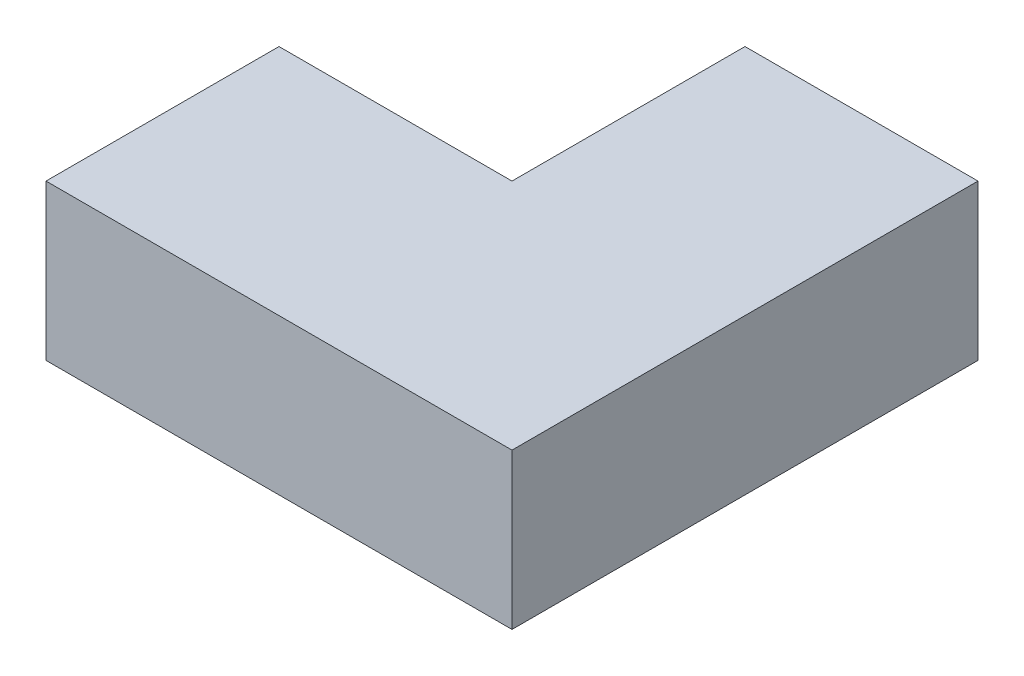
ISO-10303-21;
HEADER;
FILE_DESCRIPTION(('STEP AP214'),'2;1');
FILE_NAME('part.step','',(''),(''),'','','');
FILE_SCHEMA(('AUTOMOTIVE_DESIGN { 1 0 10303 214 1 1 1 1 }'));
ENDSEC;
DATA;
#1=APPLICATION_CONTEXT('core data for automotive mechanical design processes');
#2=APPLICATION_PROTOCOL_DEFINITION('international standard','automotive_design',2000,#1);
#3=PRODUCT_CONTEXT('',#1,'mechanical');
#4=PRODUCT('Part','Part','',(#3));
#5=PRODUCT_RELATED_PRODUCT_CATEGORY('part','',(#4));
#6=PRODUCT_DEFINITION_FORMATION('','',#4);
#7=PRODUCT_DEFINITION_CONTEXT('part definition',#1,'design');
#8=PRODUCT_DEFINITION('design','',#6,#7);
#9=PRODUCT_DEFINITION_SHAPE('','',#8);
#10=(LENGTH_UNIT() NAMED_UNIT(*) SI_UNIT(.MILLI.,.METRE.));
#11=(NAMED_UNIT(*) PLANE_ANGLE_UNIT() SI_UNIT($,.RADIAN.));
#12=(NAMED_UNIT(*) SI_UNIT($,.STERADIAN.) SOLID_ANGLE_UNIT());
#13=UNCERTAINTY_MEASURE_WITH_UNIT(LENGTH_MEASURE(1.E-05),#10,'distance_accuracy_value','');
#14=(GEOMETRIC_REPRESENTATION_CONTEXT(3) GLOBAL_UNCERTAINTY_ASSIGNED_CONTEXT((#13)) GLOBAL_UNIT_ASSIGNED_CONTEXT((#10,
#11,#12)) REPRESENTATION_CONTEXT('',''));
#15=CARTESIAN_POINT('',(0.,0.,0.));
#16=DIRECTION('',(0.,0.,1.));
#17=DIRECTION('',(1.,0.,0.));
#18=AXIS2_PLACEMENT_3D('',#15,#16,#17);
#19=CARTESIAN_POINT('',(7.,0.5,0.));
#20=DIRECTION('',(0.,0.,-1.));
#21=DIRECTION('',(-1.,0.,0.));
#22=AXIS2_PLACEMENT_3D('',#19,#20,#21);
#23=PLANE('',#22);
#24=DIRECTION('',(1.,0.,0.));
#25=VECTOR('',#24,1.);
#26=CARTESIAN_POINT('',(7.,0.,0.));
#27=LINE('',#26,#25);
#28=CARTESIAN_POINT('',(0.,0.,0.));
#29=VERTEX_POINT('',#28);
#30=CARTESIAN_POINT('',(7.,0.,0.));
#31=VERTEX_POINT('',#30);
#32=EDGE_CURVE('E87',#29,#31,#27,.T.);
#33=ORIENTED_EDGE('',*,*,#32,.T.);
#34=DIRECTION('',(0.,-1.,0.));
#35=VECTOR('',#34,1.);
#36=CARTESIAN_POINT('',(7.,0.5,0.));
#37=LINE('',#36,#35);
#38=CARTESIAN_POINT('',(7.,0.5,0.));
#39=VERTEX_POINT('',#38);
#40=EDGE_CURVE('E11',#39,#31,#37,.T.);
#41=ORIENTED_EDGE('',*,*,#40,.F.);
#42=DIRECTION('',(1.,0.,0.));
#43=VECTOR('',#42,1.);
#44=CARTESIAN_POINT('',(7.,0.5,0.));
#45=LINE('',#44,#43);
#46=CARTESIAN_POINT('',(0.,0.5,0.));
#47=VERTEX_POINT('',#46);
#48=EDGE_CURVE('E82',#47,#39,#45,.T.);
#49=ORIENTED_EDGE('',*,*,#48,.F.);
#50=DIRECTION('',(0.,-1.,0.));
#51=VECTOR('',#50,1.);
#52=CARTESIAN_POINT('',(0.,0.5,0.));
#53=LINE('',#52,#51);
#54=EDGE_CURVE('E49',#47,#29,#53,.T.);
#55=ORIENTED_EDGE('',*,*,#54,.T.);
#56=EDGE_LOOP('',(#33,#41,#49,#55));
#57=FACE_BOUND('',#56,.T.);
#58=ADVANCED_FACE('F33',(#57),#23,.F.);
#59=CARTESIAN_POINT('',(7.,0.5,-7.));
#60=DIRECTION('',(-1.,0.,0.));
#61=DIRECTION('',(0.,0.,1.));
#62=AXIS2_PLACEMENT_3D('',#59,#60,#61);
#63=PLANE('',#62);
#64=DIRECTION('',(0.,0.,-1.));
#65=VECTOR('',#64,1.);
#66=CARTESIAN_POINT('',(7.,0.,-7.));
#67=LINE('',#66,#65);
#68=CARTESIAN_POINT('',(7.,0.,-7.));
#69=VERTEX_POINT('',#68);
#70=EDGE_CURVE('E94',#31,#69,#67,.T.);
#71=ORIENTED_EDGE('',*,*,#70,.T.);
#72=DIRECTION('',(0.,-1.,0.));
#73=VECTOR('',#72,1.);
#74=CARTESIAN_POINT('',(7.,0.5,-7.));
#75=LINE('',#74,#73);
#76=CARTESIAN_POINT('',(7.,0.5,-7.));
#77=VERTEX_POINT('',#76);
#78=EDGE_CURVE('E41',#77,#69,#75,.T.);
#79=ORIENTED_EDGE('',*,*,#78,.F.);
#80=DIRECTION('',(0.,0.,-1.));
#81=VECTOR('',#80,1.);
#82=CARTESIAN_POINT('',(7.,0.5,-7.));
#83=LINE('',#82,#81);
#84=EDGE_CURVE('E90',#39,#77,#83,.T.);
#85=ORIENTED_EDGE('',*,*,#84,.F.);
#86=ORIENTED_EDGE('',*,*,#40,.T.);
#87=EDGE_LOOP('',(#71,#79,#85,#86));
#88=FACE_BOUND('',#87,.T.);
#89=ADVANCED_FACE('F172',(#88),#63,.F.);
#90=CARTESIAN_POINT('',(4.5,0.5,-7.));
#91=DIRECTION('',(0.,0.,1.));
#92=DIRECTION('',(1.,0.,0.));
#93=AXIS2_PLACEMENT_3D('',#90,#91,#92);
#94=PLANE('',#93);
#95=DIRECTION('',(-1.,0.,0.));
#96=VECTOR('',#95,1.);
#97=CARTESIAN_POINT('',(4.5,0.,-7.));
#98=LINE('',#97,#96);
#99=CARTESIAN_POINT('',(4.5,0.,-7.));
#100=VERTEX_POINT('',#99);
#101=EDGE_CURVE('E97',#69,#100,#98,.T.);
#102=ORIENTED_EDGE('',*,*,#101,.T.);
#103=DIRECTION('',(0.,-1.,0.));
#104=VECTOR('',#103,1.);
#105=CARTESIAN_POINT('',(4.5,0.5,-7.));
#106=LINE('',#105,#104);
#107=CARTESIAN_POINT('',(4.5,3.5,-7.));
#108=VERTEX_POINT('',#107);
#109=EDGE_CURVE('E112',#108,#100,#106,.T.);
#110=ORIENTED_EDGE('',*,*,#109,.F.);
#111=DIRECTION('',(-1.,0.,0.));
#112=VECTOR('',#111,1.);
#113=CARTESIAN_POINT('',(9.,3.5,-7.));
#114=LINE('',#113,#112);
#115=CARTESIAN_POINT('',(9.,3.5,-7.));
#116=VERTEX_POINT('',#115);
#117=EDGE_CURVE('E153',#116,#108,#114,.T.);
#118=ORIENTED_EDGE('',*,*,#117,.F.);
#119=DIRECTION('',(0.,-1.,0.));
#120=VECTOR('',#119,1.);
#121=CARTESIAN_POINT('',(9.,3.5,-7.));
#122=LINE('',#121,#120);
#123=CARTESIAN_POINT('',(9.,0.5,-7.));
#124=VERTEX_POINT('',#123);
#125=EDGE_CURVE('E158',#116,#124,#122,.T.);
#126=ORIENTED_EDGE('',*,*,#125,.T.);
#127=DIRECTION('',(-1.,0.,0.));
#128=VECTOR('',#127,1.);
#129=CARTESIAN_POINT('',(7.,0.5,-7.));
#130=LINE('',#129,#128);
#131=EDGE_CURVE('E122',#124,#77,#130,.T.);
#132=ORIENTED_EDGE('',*,*,#131,.T.);
#133=ORIENTED_EDGE('',*,*,#78,.T.);
#134=EDGE_LOOP('',(#102,#110,#118,#126,#132,#133));
#135=FACE_BOUND('',#134,.T.);
#136=ADVANCED_FACE('F118',(#135),#94,.F.);
#137=CARTESIAN_POINT('',(4.5,0.5,-2.5));
#138=DIRECTION('',(1.,0.,0.));
#139=DIRECTION('',(0.,0.,-1.));
#140=AXIS2_PLACEMENT_3D('',#137,#138,#139);
#141=PLANE('',#140);
#142=DIRECTION('',(0.,0.,1.));
#143=VECTOR('',#142,1.);
#144=CARTESIAN_POINT('',(4.5,0.,-2.5));
#145=LINE('',#144,#143);
#146=CARTESIAN_POINT('',(4.5,0.,-2.5));
#147=VERTEX_POINT('',#146);
#148=EDGE_CURVE('E106',#100,#147,#145,.T.);
#149=ORIENTED_EDGE('',*,*,#148,.T.);
#150=DIRECTION('',(0.,-1.,0.));
#151=VECTOR('',#150,1.);
#152=CARTESIAN_POINT('',(4.5,0.5,-2.5));
#153=LINE('',#152,#151);
#154=CARTESIAN_POINT('',(4.5,3.5,-2.5));
#155=VERTEX_POINT('',#154);
#156=EDGE_CURVE('E110',#155,#147,#153,.T.);
#157=ORIENTED_EDGE('',*,*,#156,.F.);
#158=DIRECTION('',(0.,0.,1.));
#159=VECTOR('',#158,1.);
#160=CARTESIAN_POINT('',(4.5,3.5,-7.));
#161=LINE('',#160,#159);
#162=EDGE_CURVE('E156',#108,#155,#161,.T.);
#163=ORIENTED_EDGE('',*,*,#162,.F.);
#164=ORIENTED_EDGE('',*,*,#109,.T.);
#165=EDGE_LOOP('',(#149,#157,#163,#164));
#166=FACE_BOUND('',#165,.T.);
#167=ADVANCED_FACE('F128',(#166),#141,.F.);
#168=CARTESIAN_POINT('',(0.,0.5,-2.5));
#169=DIRECTION('',(0.,0.,1.));
#170=DIRECTION('',(1.,0.,0.));
#171=AXIS2_PLACEMENT_3D('',#168,#169,#170);
#172=PLANE('',#171);
#173=DIRECTION('',(-1.,0.,0.));
#174=VECTOR('',#173,1.);
#175=CARTESIAN_POINT('',(0.,0.,-2.5));
#176=LINE('',#175,#174);
#177=CARTESIAN_POINT('',(0.,0.,-2.5));
#178=VERTEX_POINT('',#177);
#179=EDGE_CURVE('E73',#147,#178,#176,.T.);
#180=ORIENTED_EDGE('',*,*,#179,.T.);
#181=DIRECTION('',(0.,-1.,0.));
#182=VECTOR('',#181,1.);
#183=CARTESIAN_POINT('',(0.,0.5,-2.5));
#184=LINE('',#183,#182);
#185=CARTESIAN_POINT('',(0.,3.5,-2.5));
#186=VERTEX_POINT('',#185);
#187=EDGE_CURVE('E79',#186,#178,#184,.T.);
#188=ORIENTED_EDGE('',*,*,#187,.F.);
#189=DIRECTION('',(-1.,0.,0.));
#190=VECTOR('',#189,1.);
#191=CARTESIAN_POINT('',(4.5,3.5,-2.5));
#192=LINE('',#191,#190);
#193=EDGE_CURVE('E135',#155,#186,#192,.T.);
#194=ORIENTED_EDGE('',*,*,#193,.F.);
#195=ORIENTED_EDGE('',*,*,#156,.T.);
#196=EDGE_LOOP('',(#180,#188,#194,#195));
#197=FACE_BOUND('',#196,.T.);
#198=ADVANCED_FACE('F133',(#197),#172,.F.);
#199=CARTESIAN_POINT('',(0.,0.5,0.));
#200=DIRECTION('',(1.,0.,0.));
#201=DIRECTION('',(0.,0.,-1.));
#202=AXIS2_PLACEMENT_3D('',#199,#200,#201);
#203=PLANE('',#202);
#204=DIRECTION('',(0.,0.,1.));
#205=VECTOR('',#204,1.);
#206=CARTESIAN_POINT('',(0.,0.,0.));
#207=LINE('',#206,#205);
#208=EDGE_CURVE('E76',#178,#29,#207,.T.);
#209=ORIENTED_EDGE('',*,*,#208,.T.);
#210=ORIENTED_EDGE('',*,*,#54,.F.);
#211=DIRECTION('',(0.,0.,1.));
#212=VECTOR('',#211,1.);
#213=CARTESIAN_POINT('',(0.,0.5,0.));
#214=LINE('',#213,#212);
#215=CARTESIAN_POINT('',(0.,0.5,2.));
#216=VERTEX_POINT('',#215);
#217=EDGE_CURVE('E159',#47,#216,#214,.T.);
#218=ORIENTED_EDGE('',*,*,#217,.T.);
#219=DIRECTION('',(0.,-1.,0.));
#220=VECTOR('',#219,1.);
#221=CARTESIAN_POINT('',(0.,3.5,2.));
#222=LINE('',#221,#220);
#223=CARTESIAN_POINT('',(0.,3.5,2.));
#224=VERTEX_POINT('',#223);
#225=EDGE_CURVE('E95',#224,#216,#222,.T.);
#226=ORIENTED_EDGE('',*,*,#225,.F.);
#227=DIRECTION('',(0.,0.,1.));
#228=VECTOR('',#227,1.);
#229=CARTESIAN_POINT('',(0.,3.5,-2.5));
#230=LINE('',#229,#228);
#231=EDGE_CURVE('E141',#186,#224,#230,.T.);
#232=ORIENTED_EDGE('',*,*,#231,.F.);
#233=ORIENTED_EDGE('',*,*,#187,.T.);
#234=EDGE_LOOP('',(#209,#210,#218,#226,#232,#233));
#235=FACE_BOUND('',#234,.T.);
#236=ADVANCED_FACE('F77',(#235),#203,.F.);
#237=CARTESIAN_POINT('',(0.,0.,0.));
#238=DIRECTION('',(0.,-1.,0.));
#239=DIRECTION('',(0.,0.,-1.));
#240=AXIS2_PLACEMENT_3D('',#237,#238,#239);
#241=PLANE('',#240);
#242=ORIENTED_EDGE('',*,*,#32,.F.);
#243=ORIENTED_EDGE('',*,*,#208,.F.);
#244=ORIENTED_EDGE('',*,*,#179,.F.);
#245=ORIENTED_EDGE('',*,*,#148,.F.);
#246=ORIENTED_EDGE('',*,*,#101,.F.);
#247=ORIENTED_EDGE('',*,*,#70,.F.);
#248=EDGE_LOOP('',(#242,#243,#244,#245,#246,#247));
#249=FACE_BOUND('',#248,.T.);
#250=ADVANCED_FACE('F92',(#249),#241,.T.);
#251=CARTESIAN_POINT('',(0.,0.5,0.));
#252=DIRECTION('',(0.,1.,0.));
#253=DIRECTION('',(0.,0.,1.));
#254=AXIS2_PLACEMENT_3D('',#251,#252,#253);
#255=PLANE('',#254);
#256=ORIENTED_EDGE('',*,*,#217,.F.);
#257=ORIENTED_EDGE('',*,*,#48,.T.);
#258=ORIENTED_EDGE('',*,*,#84,.T.);
#259=ORIENTED_EDGE('',*,*,#131,.F.);
#260=DIRECTION('',(0.,0.,-1.));
#261=VECTOR('',#260,1.);
#262=CARTESIAN_POINT('',(9.,0.5,2.));
#263=LINE('',#262,#261);
#264=CARTESIAN_POINT('',(9.,0.5,2.));
#265=VERTEX_POINT('',#264);
#266=EDGE_CURVE('E145',#265,#124,#263,.T.);
#267=ORIENTED_EDGE('',*,*,#266,.F.);
#268=DIRECTION('',(1.,0.,0.));
#269=VECTOR('',#268,1.);
#270=CARTESIAN_POINT('',(0.,0.5,2.));
#271=LINE('',#270,#269);
#272=EDGE_CURVE('E161',#216,#265,#271,.T.);
#273=ORIENTED_EDGE('',*,*,#272,.F.);
#274=EDGE_LOOP('',(#256,#257,#258,#259,#267,#273));
#275=FACE_BOUND('',#274,.T.);
#276=ADVANCED_FACE('F169',(#275),#255,.F.);
#277=CARTESIAN_POINT('',(0.,3.5,2.));
#278=DIRECTION('',(0.,0.,-1.));
#279=DIRECTION('',(-1.,0.,0.));
#280=AXIS2_PLACEMENT_3D('',#277,#278,#279);
#281=PLANE('',#280);
#282=ORIENTED_EDGE('',*,*,#272,.T.);
#283=DIRECTION('',(0.,-1.,0.));
#284=VECTOR('',#283,1.);
#285=CARTESIAN_POINT('',(9.,3.5,2.));
#286=LINE('',#285,#284);
#287=CARTESIAN_POINT('',(9.,3.5,2.));
#288=VERTEX_POINT('',#287);
#289=EDGE_CURVE('E100',#288,#265,#286,.T.);
#290=ORIENTED_EDGE('',*,*,#289,.F.);
#291=DIRECTION('',(1.,0.,0.));
#292=VECTOR('',#291,1.);
#293=CARTESIAN_POINT('',(0.,3.5,2.));
#294=LINE('',#293,#292);
#295=EDGE_CURVE('E143',#224,#288,#294,.T.);
#296=ORIENTED_EDGE('',*,*,#295,.F.);
#297=ORIENTED_EDGE('',*,*,#225,.T.);
#298=EDGE_LOOP('',(#282,#290,#296,#297));
#299=FACE_BOUND('',#298,.T.);
#300=ADVANCED_FACE('F188',(#299),#281,.F.);
#301=CARTESIAN_POINT('',(9.,3.5,2.));
#302=DIRECTION('',(-1.,0.,0.));
#303=DIRECTION('',(0.,0.,1.));
#304=AXIS2_PLACEMENT_3D('',#301,#302,#303);
#305=PLANE('',#304);
#306=ORIENTED_EDGE('',*,*,#266,.T.);
#307=ORIENTED_EDGE('',*,*,#125,.F.);
#308=DIRECTION('',(0.,0.,-1.));
#309=VECTOR('',#308,1.);
#310=CARTESIAN_POINT('',(9.,3.5,2.));
#311=LINE('',#310,#309);
#312=EDGE_CURVE('E150',#288,#116,#311,.T.);
#313=ORIENTED_EDGE('',*,*,#312,.F.);
#314=ORIENTED_EDGE('',*,*,#289,.T.);
#315=EDGE_LOOP('',(#306,#307,#313,#314));
#316=FACE_BOUND('',#315,.T.);
#317=ADVANCED_FACE('F191',(#316),#305,.F.);
#318=CARTESIAN_POINT('',(0.,3.5,0.));
#319=DIRECTION('',(0.,1.,0.));
#320=DIRECTION('',(0.,0.,1.));
#321=AXIS2_PLACEMENT_3D('',#318,#319,#320);
#322=PLANE('',#321);
#323=ORIENTED_EDGE('',*,*,#193,.T.);
#324=ORIENTED_EDGE('',*,*,#231,.T.);
#325=ORIENTED_EDGE('',*,*,#295,.T.);
#326=ORIENTED_EDGE('',*,*,#312,.T.);
#327=ORIENTED_EDGE('',*,*,#117,.T.);
#328=ORIENTED_EDGE('',*,*,#162,.T.);
#329=EDGE_LOOP('',(#323,#324,#325,#326,#327,#328));
#330=FACE_BOUND('',#329,.T.);
#331=ADVANCED_FACE('F195',(#330),#322,.T.);
#332=CLOSED_SHELL('',(#58,#89,#136,#167,#198,#236,#250,#276,#300,#317,#331));
#333=MANIFOLD_SOLID_BREP('B2',#332);
#334=ADVANCED_BREP_SHAPE_REPRESENTATION('',(#18,#333),#14);
#335=SHAPE_DEFINITION_REPRESENTATION(#9,#334);
ENDSEC;
END-ISO-10303-21;
